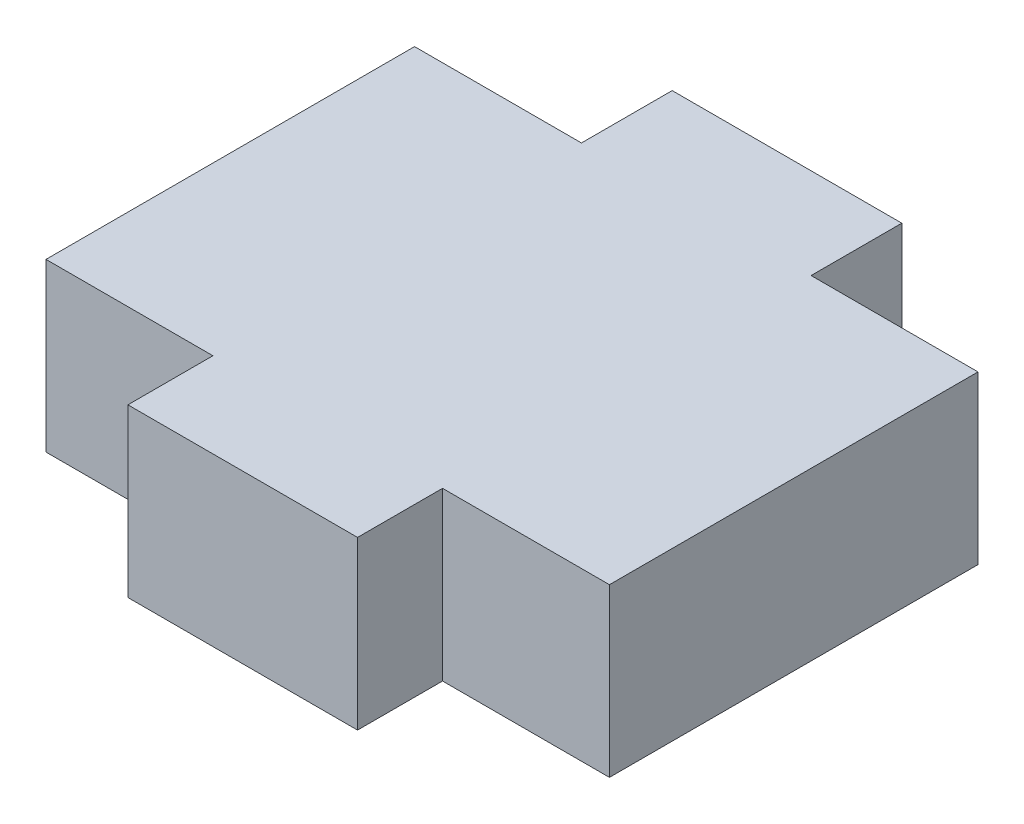
ISO-10303-21;
HEADER;
FILE_DESCRIPTION(('STEP AP214'),'2;1');
FILE_NAME('part.step','',(''),(''),'','','');
FILE_SCHEMA(('AUTOMOTIVE_DESIGN { 1 0 10303 214 1 1 1 1 }'));
ENDSEC;
DATA;
#1=APPLICATION_CONTEXT('core data for automotive mechanical design processes');
#2=APPLICATION_PROTOCOL_DEFINITION('international standard','automotive_design',2000,#1);
#3=PRODUCT_CONTEXT('',#1,'mechanical');
#4=PRODUCT('Part','Part','',(#3));
#5=PRODUCT_RELATED_PRODUCT_CATEGORY('part','',(#4));
#6=PRODUCT_DEFINITION_FORMATION('','',#4);
#7=PRODUCT_DEFINITION_CONTEXT('part definition',#1,'design');
#8=PRODUCT_DEFINITION('design','',#6,#7);
#9=PRODUCT_DEFINITION_SHAPE('','',#8);
#10=(LENGTH_UNIT() NAMED_UNIT(*) SI_UNIT(.MILLI.,.METRE.));
#11=(NAMED_UNIT(*) PLANE_ANGLE_UNIT() SI_UNIT($,.RADIAN.));
#12=(NAMED_UNIT(*) SI_UNIT($,.STERADIAN.) SOLID_ANGLE_UNIT());
#13=UNCERTAINTY_MEASURE_WITH_UNIT(LENGTH_MEASURE(1.E-05),#10,'distance_accuracy_value','');
#14=(GEOMETRIC_REPRESENTATION_CONTEXT(3) GLOBAL_UNCERTAINTY_ASSIGNED_CONTEXT((#13)) GLOBAL_UNIT_ASSIGNED_CONTEXT((#10,
#11,#12)) REPRESENTATION_CONTEXT('',''));
#15=CARTESIAN_POINT('',(0.,0.,0.));
#16=DIRECTION('',(0.,0.,1.));
#17=DIRECTION('',(1.,0.,0.));
#18=AXIS2_PLACEMENT_3D('',#15,#16,#17);
#19=CARTESIAN_POINT('',(0.,5.842,0.));
#20=DIRECTION('',(-1.,0.,0.));
#21=DIRECTION('',(0.,0.,1.));
#22=AXIS2_PLACEMENT_3D('',#19,#20,#21);
#23=PLANE('',#22);
#24=DIRECTION('',(0.,0.,-1.));
#25=VECTOR('',#24,1.);
#26=CARTESIAN_POINT('',(0.,0.,0.));
#27=LINE('',#26,#25);
#28=CARTESIAN_POINT('',(0.,0.,0.));
#29=VERTEX_POINT('',#28);
#30=CARTESIAN_POINT('',(0.,0.,-2.975));
#31=VERTEX_POINT('',#30);
#32=EDGE_CURVE('E158',#29,#31,#27,.T.);
#33=ORIENTED_EDGE('',*,*,#32,.T.);
#34=DIRECTION('',(0.,-1.,0.));
#35=VECTOR('',#34,1.);
#36=CARTESIAN_POINT('',(0.,5.842,-2.975));
#37=LINE('',#36,#35);
#38=CARTESIAN_POINT('',(0.,5.842,-2.975));
#39=VERTEX_POINT('',#38);
#40=EDGE_CURVE('E11',#39,#31,#37,.T.);
#41=ORIENTED_EDGE('',*,*,#40,.F.);
#42=DIRECTION('',(0.,0.,-1.));
#43=VECTOR('',#42,1.);
#44=CARTESIAN_POINT('',(0.,5.842,0.));
#45=LINE('',#44,#43);
#46=CARTESIAN_POINT('',(0.,5.842,0.));
#47=VERTEX_POINT('',#46);
#48=EDGE_CURVE('E180',#47,#39,#45,.T.);
#49=ORIENTED_EDGE('',*,*,#48,.F.);
#50=DIRECTION('',(0.,-1.,0.));
#51=VECTOR('',#50,1.);
#52=CARTESIAN_POINT('',(0.,5.842,0.));
#53=LINE('',#52,#51);
#54=EDGE_CURVE('E154',#47,#29,#53,.T.);
#55=ORIENTED_EDGE('',*,*,#54,.T.);
#56=EDGE_LOOP('',(#33,#41,#49,#55));
#57=FACE_BOUND('',#56,.T.);
#58=ADVANCED_FACE('F38',(#57),#23,.F.);
#59=CARTESIAN_POINT('',(0.,5.842,-2.975));
#60=DIRECTION('',(0.,0.,-1.));
#61=DIRECTION('',(-1.,0.,0.));
#62=AXIS2_PLACEMENT_3D('',#59,#60,#61);
#63=PLANE('',#62);
#64=DIRECTION('',(1.,0.,0.));
#65=VECTOR('',#64,1.);
#66=CARTESIAN_POINT('',(0.,0.,-2.975));
#67=LINE('',#66,#65);
#68=CARTESIAN_POINT('',(5.842,0.,-2.975));
#69=VERTEX_POINT('',#68);
#70=EDGE_CURVE('E161',#31,#69,#67,.T.);
#71=ORIENTED_EDGE('',*,*,#70,.T.);
#72=DIRECTION('',(0.,-1.,0.));
#73=VECTOR('',#72,1.);
#74=CARTESIAN_POINT('',(5.842,5.842,-2.975));
#75=LINE('',#74,#73);
#76=CARTESIAN_POINT('',(5.842,5.842,-2.975));
#77=VERTEX_POINT('',#76);
#78=EDGE_CURVE('E46',#77,#69,#75,.T.);
#79=ORIENTED_EDGE('',*,*,#78,.F.);
#80=DIRECTION('',(1.,0.,0.));
#81=VECTOR('',#80,1.);
#82=CARTESIAN_POINT('',(0.,5.842,-2.975));
#83=LINE('',#82,#81);
#84=EDGE_CURVE('E109',#39,#77,#83,.T.);
#85=ORIENTED_EDGE('',*,*,#84,.F.);
#86=ORIENTED_EDGE('',*,*,#40,.T.);
#87=EDGE_LOOP('',(#71,#79,#85,#86));
#88=FACE_BOUND('',#87,.T.);
#89=ADVANCED_FACE('F258',(#88),#63,.F.);
#90=CARTESIAN_POINT('',(5.842,5.842,-2.975));
#91=DIRECTION('',(-1.,0.,0.));
#92=DIRECTION('',(0.,0.,1.));
#93=AXIS2_PLACEMENT_3D('',#90,#91,#92);
#94=PLANE('',#93);
#95=DIRECTION('',(0.,0.,-1.));
#96=VECTOR('',#95,1.);
#97=CARTESIAN_POINT('',(5.842,0.,-2.975));
#98=LINE('',#97,#96);
#99=CARTESIAN_POINT('',(5.842,0.,-15.875));
#100=VERTEX_POINT('',#99);
#101=EDGE_CURVE('E163',#69,#100,#98,.T.);
#102=ORIENTED_EDGE('',*,*,#101,.T.);
#103=DIRECTION('',(0.,-1.,0.));
#104=VECTOR('',#103,1.);
#105=CARTESIAN_POINT('',(5.842,5.842,-15.875));
#106=LINE('',#105,#104);
#107=CARTESIAN_POINT('',(5.842,5.842,-15.875));
#108=VERTEX_POINT('',#107);
#109=EDGE_CURVE('E199',#108,#100,#106,.T.);
#110=ORIENTED_EDGE('',*,*,#109,.F.);
#111=DIRECTION('',(0.,0.,-1.));
#112=VECTOR('',#111,1.);
#113=CARTESIAN_POINT('',(5.842,5.842,-2.975));
#114=LINE('',#113,#112);
#115=EDGE_CURVE('E207',#77,#108,#114,.T.);
#116=ORIENTED_EDGE('',*,*,#115,.F.);
#117=ORIENTED_EDGE('',*,*,#78,.T.);
#118=EDGE_LOOP('',(#102,#110,#116,#117));
#119=FACE_BOUND('',#118,.T.);
#120=ADVANCED_FACE('F205',(#119),#94,.F.);
#121=CARTESIAN_POINT('',(0.,5.842,-15.875));
#122=DIRECTION('',(0.,0.,1.));
#123=DIRECTION('',(1.,0.,0.));
#124=AXIS2_PLACEMENT_3D('',#121,#122,#123);
#125=PLANE('',#124);
#126=DIRECTION('',(-1.,0.,0.));
#127=VECTOR('',#126,1.);
#128=CARTESIAN_POINT('',(0.,0.,-15.875));
#129=LINE('',#128,#127);
#130=CARTESIAN_POINT('',(0.,0.,-15.875));
#131=VERTEX_POINT('',#130);
#132=EDGE_CURVE('E165',#100,#131,#129,.T.);
#133=ORIENTED_EDGE('',*,*,#132,.T.);
#134=DIRECTION('',(0.,-1.,0.));
#135=VECTOR('',#134,1.);
#136=CARTESIAN_POINT('',(0.,5.842,-15.875));
#137=LINE('',#136,#135);
#138=CARTESIAN_POINT('',(0.,5.842,-15.875));
#139=VERTEX_POINT('',#138);
#140=EDGE_CURVE('E196',#139,#131,#137,.T.);
#141=ORIENTED_EDGE('',*,*,#140,.F.);
#142=DIRECTION('',(-1.,0.,0.));
#143=VECTOR('',#142,1.);
#144=CARTESIAN_POINT('',(0.,5.842,-15.875));
#145=LINE('',#144,#143);
#146=EDGE_CURVE('E225',#108,#139,#145,.T.);
#147=ORIENTED_EDGE('',*,*,#146,.F.);
#148=ORIENTED_EDGE('',*,*,#109,.T.);
#149=EDGE_LOOP('',(#133,#141,#147,#148));
#150=FACE_BOUND('',#149,.T.);
#151=ADVANCED_FACE('F216',(#150),#125,.F.);
#152=CARTESIAN_POINT('',(0.,5.842,-15.875));
#153=DIRECTION('',(-1.,0.,0.));
#154=DIRECTION('',(0.,0.,1.));
#155=AXIS2_PLACEMENT_3D('',#152,#153,#154);
#156=PLANE('',#155);
#157=DIRECTION('',(0.,0.,-1.));
#158=VECTOR('',#157,1.);
#159=CARTESIAN_POINT('',(0.,0.,-15.875));
#160=LINE('',#159,#158);
#161=CARTESIAN_POINT('',(0.,0.,-19.05));
#162=VERTEX_POINT('',#161);
#163=EDGE_CURVE('E167',#131,#162,#160,.T.);
#164=ORIENTED_EDGE('',*,*,#163,.T.);
#165=DIRECTION('',(0.,-1.,0.));
#166=VECTOR('',#165,1.);
#167=CARTESIAN_POINT('',(0.,5.842,-19.05));
#168=LINE('',#167,#166);
#169=CARTESIAN_POINT('',(0.,5.842,-19.05));
#170=VERTEX_POINT('',#169);
#171=EDGE_CURVE('E193',#170,#162,#168,.T.);
#172=ORIENTED_EDGE('',*,*,#171,.F.);
#173=DIRECTION('',(0.,0.,-1.));
#174=VECTOR('',#173,1.);
#175=CARTESIAN_POINT('',(0.,5.842,-15.875));
#176=LINE('',#175,#174);
#177=EDGE_CURVE('E222',#139,#170,#176,.T.);
#178=ORIENTED_EDGE('',*,*,#177,.F.);
#179=ORIENTED_EDGE('',*,*,#140,.T.);
#180=EDGE_LOOP('',(#164,#172,#178,#179));
#181=FACE_BOUND('',#180,.T.);
#182=ADVANCED_FACE('F220',(#181),#156,.F.);
#183=CARTESIAN_POINT('',(0.,5.842,-19.05));
#184=DIRECTION('',(0.,0.,1.));
#185=DIRECTION('',(1.,0.,0.));
#186=AXIS2_PLACEMENT_3D('',#183,#184,#185);
#187=PLANE('',#186);
#188=DIRECTION('',(-1.,0.,0.));
#189=VECTOR('',#188,1.);
#190=CARTESIAN_POINT('',(0.,0.,-19.05));
#191=LINE('',#190,#189);
#192=CARTESIAN_POINT('',(-8.0375,0.,-19.05));
#193=VERTEX_POINT('',#192);
#194=EDGE_CURVE('E169',#162,#193,#191,.T.);
#195=ORIENTED_EDGE('',*,*,#194,.T.);
#196=DIRECTION('',(0.,-1.,0.));
#197=VECTOR('',#196,1.);
#198=CARTESIAN_POINT('',(-8.0375,5.842,-19.05));
#199=LINE('',#198,#197);
#200=CARTESIAN_POINT('',(-8.0375,5.842,-19.05));
#201=VERTEX_POINT('',#200);
#202=EDGE_CURVE('E190',#201,#193,#199,.T.);
#203=ORIENTED_EDGE('',*,*,#202,.F.);
#204=DIRECTION('',(-1.,0.,0.));
#205=VECTOR('',#204,1.);
#206=CARTESIAN_POINT('',(0.,5.842,-19.05));
#207=LINE('',#206,#205);
#208=EDGE_CURVE('E224',#170,#201,#207,.T.);
#209=ORIENTED_EDGE('',*,*,#208,.F.);
#210=ORIENTED_EDGE('',*,*,#171,.T.);
#211=EDGE_LOOP('',(#195,#203,#209,#210));
#212=FACE_BOUND('',#211,.T.);
#213=ADVANCED_FACE('F271',(#212),#187,.F.);
#214=CARTESIAN_POINT('',(-8.03750000000001,5.842,-15.875));
#215=DIRECTION('',(1.,0.,0.));
#216=DIRECTION('',(0.,0.,-1.));
#217=AXIS2_PLACEMENT_3D('',#214,#215,#216);
#218=PLANE('',#217);
#219=DIRECTION('',(0.,0.,1.));
#220=VECTOR('',#219,1.);
#221=CARTESIAN_POINT('',(-8.03750000000001,0.,-15.875));
#222=LINE('',#221,#220);
#223=CARTESIAN_POINT('',(-8.03750000000001,0.,-15.875));
#224=VERTEX_POINT('',#223);
#225=EDGE_CURVE('E171',#193,#224,#222,.T.);
#226=ORIENTED_EDGE('',*,*,#225,.T.);
#227=DIRECTION('',(0.,-1.,0.));
#228=VECTOR('',#227,1.);
#229=CARTESIAN_POINT('',(-8.03750000000001,5.842,-15.875));
#230=LINE('',#229,#228);
#231=CARTESIAN_POINT('',(-8.03750000000001,5.842,-15.875));
#232=VERTEX_POINT('',#231);
#233=EDGE_CURVE('E187',#232,#224,#230,.T.);
#234=ORIENTED_EDGE('',*,*,#233,.F.);
#235=DIRECTION('',(0.,0.,1.));
#236=VECTOR('',#235,1.);
#237=CARTESIAN_POINT('',(-8.03750000000001,5.842,-15.875));
#238=LINE('',#237,#236);
#239=EDGE_CURVE('E227',#201,#232,#238,.T.);
#240=ORIENTED_EDGE('',*,*,#239,.F.);
#241=ORIENTED_EDGE('',*,*,#202,.T.);
#242=EDGE_LOOP('',(#226,#234,#240,#241));
#243=FACE_BOUND('',#242,.T.);
#244=ADVANCED_FACE('F274',(#243),#218,.F.);
#245=CARTESIAN_POINT('',(-8.03750000000001,5.842,-15.875));
#246=DIRECTION('',(0.,0.,1.));
#247=DIRECTION('',(1.,0.,0.));
#248=AXIS2_PLACEMENT_3D('',#245,#246,#247);
#249=PLANE('',#248);
#250=DIRECTION('',(-1.,0.,0.));
#251=VECTOR('',#250,1.);
#252=CARTESIAN_POINT('',(-8.03750000000001,0.,-15.875));
#253=LINE('',#252,#251);
#254=CARTESIAN_POINT('',(-13.8795,0.,-15.875));
#255=VERTEX_POINT('',#254);
#256=EDGE_CURVE('E173',#224,#255,#253,.T.);
#257=ORIENTED_EDGE('',*,*,#256,.T.);
#258=DIRECTION('',(0.,-1.,0.));
#259=VECTOR('',#258,1.);
#260=CARTESIAN_POINT('',(-13.8795,5.842,-15.875));
#261=LINE('',#260,#259);
#262=CARTESIAN_POINT('',(-13.8795,5.842,-15.875));
#263=VERTEX_POINT('',#262);
#264=EDGE_CURVE('E184',#263,#255,#261,.T.);
#265=ORIENTED_EDGE('',*,*,#264,.F.);
#266=DIRECTION('',(-1.,0.,0.));
#267=VECTOR('',#266,1.);
#268=CARTESIAN_POINT('',(-8.03750000000001,5.842,-15.875));
#269=LINE('',#268,#267);
#270=EDGE_CURVE('E233',#232,#263,#269,.T.);
#271=ORIENTED_EDGE('',*,*,#270,.F.);
#272=ORIENTED_EDGE('',*,*,#233,.T.);
#273=EDGE_LOOP('',(#257,#265,#271,#272));
#274=FACE_BOUND('',#273,.T.);
#275=ADVANCED_FACE('F239',(#274),#249,.F.);
#276=CARTESIAN_POINT('',(-13.8795,5.842,-2.975));
#277=DIRECTION('',(1.,0.,0.));
#278=DIRECTION('',(0.,0.,-1.));
#279=AXIS2_PLACEMENT_3D('',#276,#277,#278);
#280=PLANE('',#279);
#281=DIRECTION('',(0.,0.,1.));
#282=VECTOR('',#281,1.);
#283=CARTESIAN_POINT('',(-13.8795,0.,-2.975));
#284=LINE('',#283,#282);
#285=CARTESIAN_POINT('',(-13.8795,0.,-2.975));
#286=VERTEX_POINT('',#285);
#287=EDGE_CURVE('E175',#255,#286,#284,.T.);
#288=ORIENTED_EDGE('',*,*,#287,.T.);
#289=DIRECTION('',(0.,-1.,0.));
#290=VECTOR('',#289,1.);
#291=CARTESIAN_POINT('',(-13.8795,5.842,-2.975));
#292=LINE('',#291,#290);
#293=CARTESIAN_POINT('',(-13.8795,5.842,-2.975));
#294=VERTEX_POINT('',#293);
#295=EDGE_CURVE('E149',#294,#286,#292,.T.);
#296=ORIENTED_EDGE('',*,*,#295,.F.);
#297=DIRECTION('',(0.,0.,1.));
#298=VECTOR('',#297,1.);
#299=CARTESIAN_POINT('',(-13.8795,5.842,-2.975));
#300=LINE('',#299,#298);
#301=EDGE_CURVE('E140',#263,#294,#300,.T.);
#302=ORIENTED_EDGE('',*,*,#301,.F.);
#303=ORIENTED_EDGE('',*,*,#264,.T.);
#304=EDGE_LOOP('',(#288,#296,#302,#303));
#305=FACE_BOUND('',#304,.T.);
#306=ADVANCED_FACE('F243',(#305),#280,.F.);
#307=CARTESIAN_POINT('',(-8.0375,5.842,-2.975));
#308=DIRECTION('',(0.,0.,-1.));
#309=DIRECTION('',(-1.,0.,0.));
#310=AXIS2_PLACEMENT_3D('',#307,#308,#309);
#311=PLANE('',#310);
#312=DIRECTION('',(1.,0.,0.));
#313=VECTOR('',#312,1.);
#314=CARTESIAN_POINT('',(-8.0375,0.,-2.975));
#315=LINE('',#314,#313);
#316=CARTESIAN_POINT('',(-8.0375,0.,-2.975));
#317=VERTEX_POINT('',#316);
#318=EDGE_CURVE('E148',#286,#317,#315,.T.);
#319=ORIENTED_EDGE('',*,*,#318,.T.);
#320=DIRECTION('',(0.,-1.,0.));
#321=VECTOR('',#320,1.);
#322=CARTESIAN_POINT('',(-8.0375,5.842,-2.975));
#323=LINE('',#322,#321);
#324=CARTESIAN_POINT('',(-8.0375,5.842,-2.975));
#325=VERTEX_POINT('',#324);
#326=EDGE_CURVE('E145',#325,#317,#323,.T.);
#327=ORIENTED_EDGE('',*,*,#326,.F.);
#328=DIRECTION('',(1.,0.,0.));
#329=VECTOR('',#328,1.);
#330=CARTESIAN_POINT('',(-8.0375,5.842,-2.975));
#331=LINE('',#330,#329);
#332=EDGE_CURVE('E134',#294,#325,#331,.T.);
#333=ORIENTED_EDGE('',*,*,#332,.F.);
#334=ORIENTED_EDGE('',*,*,#295,.T.);
#335=EDGE_LOOP('',(#319,#327,#333,#334));
#336=FACE_BOUND('',#335,.T.);
#337=ADVANCED_FACE('F146',(#336),#311,.F.);
#338=CARTESIAN_POINT('',(-8.0375,5.842,0.));
#339=DIRECTION('',(1.,0.,0.));
#340=DIRECTION('',(0.,0.,-1.));
#341=AXIS2_PLACEMENT_3D('',#338,#339,#340);
#342=PLANE('',#341);
#343=DIRECTION('',(0.,0.,1.));
#344=VECTOR('',#343,1.);
#345=CARTESIAN_POINT('',(-8.0375,0.,0.));
#346=LINE('',#345,#344);
#347=CARTESIAN_POINT('',(-8.0375,0.,0.));
#348=VERTEX_POINT('',#347);
#349=EDGE_CURVE('E95',#317,#348,#346,.T.);
#350=ORIENTED_EDGE('',*,*,#349,.T.);
#351=DIRECTION('',(0.,-1.,0.));
#352=VECTOR('',#351,1.);
#353=CARTESIAN_POINT('',(-8.0375,5.842,0.));
#354=LINE('',#353,#352);
#355=CARTESIAN_POINT('',(-8.0375,5.842,0.));
#356=VERTEX_POINT('',#355);
#357=EDGE_CURVE('E150',#356,#348,#354,.T.);
#358=ORIENTED_EDGE('',*,*,#357,.F.);
#359=DIRECTION('',(0.,0.,1.));
#360=VECTOR('',#359,1.);
#361=CARTESIAN_POINT('',(-8.0375,5.842,0.));
#362=LINE('',#361,#360);
#363=EDGE_CURVE('E138',#325,#356,#362,.T.);
#364=ORIENTED_EDGE('',*,*,#363,.F.);
#365=ORIENTED_EDGE('',*,*,#326,.T.);
#366=EDGE_LOOP('',(#350,#358,#364,#365));
#367=FACE_BOUND('',#366,.T.);
#368=ADVANCED_FACE('F152',(#367),#342,.F.);
#369=CARTESIAN_POINT('',(0.,5.842,0.));
#370=DIRECTION('',(0.,0.,-1.));
#371=DIRECTION('',(-1.,0.,0.));
#372=AXIS2_PLACEMENT_3D('',#369,#370,#371);
#373=PLANE('',#372);
#374=DIRECTION('',(1.,0.,0.));
#375=VECTOR('',#374,1.);
#376=CARTESIAN_POINT('',(0.,0.,0.));
#377=LINE('',#376,#375);
#378=EDGE_CURVE('E101',#348,#29,#377,.T.);
#379=ORIENTED_EDGE('',*,*,#378,.T.);
#380=ORIENTED_EDGE('',*,*,#54,.F.);
#381=DIRECTION('',(1.,0.,0.));
#382=VECTOR('',#381,1.);
#383=CARTESIAN_POINT('',(0.,5.842,0.));
#384=LINE('',#383,#382);
#385=EDGE_CURVE('E54',#356,#47,#384,.T.);
#386=ORIENTED_EDGE('',*,*,#385,.F.);
#387=ORIENTED_EDGE('',*,*,#357,.T.);
#388=EDGE_LOOP('',(#379,#380,#386,#387));
#389=FACE_BOUND('',#388,.T.);
#390=ADVANCED_FACE('F247',(#389),#373,.F.);
#391=CARTESIAN_POINT('',(0.,5.842,0.));
#392=DIRECTION('',(0.,-1.,0.));
#393=DIRECTION('',(0.,0.,-1.));
#394=AXIS2_PLACEMENT_3D('',#391,#392,#393);
#395=PLANE('',#394);
#396=ORIENTED_EDGE('',*,*,#48,.T.);
#397=ORIENTED_EDGE('',*,*,#84,.T.);
#398=ORIENTED_EDGE('',*,*,#115,.T.);
#399=ORIENTED_EDGE('',*,*,#146,.T.);
#400=ORIENTED_EDGE('',*,*,#177,.T.);
#401=ORIENTED_EDGE('',*,*,#208,.T.);
#402=ORIENTED_EDGE('',*,*,#239,.T.);
#403=ORIENTED_EDGE('',*,*,#270,.T.);
#404=ORIENTED_EDGE('',*,*,#301,.T.);
#405=ORIENTED_EDGE('',*,*,#332,.T.);
#406=ORIENTED_EDGE('',*,*,#363,.T.);
#407=ORIENTED_EDGE('',*,*,#385,.T.);
#408=EDGE_LOOP('',(#396,#397,#398,#399,#400,#401,#402,#403,#404,#405,#406,#407));
#409=FACE_BOUND('',#408,.T.);
#410=ADVANCED_FACE('F136',(#409),#395,.F.);
#411=CARTESIAN_POINT('',(0.,0.,0.));
#412=DIRECTION('',(0.,-1.,0.));
#413=DIRECTION('',(0.,0.,-1.));
#414=AXIS2_PLACEMENT_3D('',#411,#412,#413);
#415=PLANE('',#414);
#416=ORIENTED_EDGE('',*,*,#32,.F.);
#417=ORIENTED_EDGE('',*,*,#378,.F.);
#418=ORIENTED_EDGE('',*,*,#349,.F.);
#419=ORIENTED_EDGE('',*,*,#318,.F.);
#420=ORIENTED_EDGE('',*,*,#287,.F.);
#421=ORIENTED_EDGE('',*,*,#256,.F.);
#422=ORIENTED_EDGE('',*,*,#225,.F.);
#423=ORIENTED_EDGE('',*,*,#194,.F.);
#424=ORIENTED_EDGE('',*,*,#163,.F.);
#425=ORIENTED_EDGE('',*,*,#132,.F.);
#426=ORIENTED_EDGE('',*,*,#101,.F.);
#427=ORIENTED_EDGE('',*,*,#70,.F.);
#428=EDGE_LOOP('',(#416,#417,#418,#419,#420,#421,#422,#423,#424,#425,#426,#427));
#429=FACE_BOUND('',#428,.T.);
#430=ADVANCED_FACE('F211',(#429),#415,.T.);
#431=CLOSED_SHELL('',(#58,#89,#120,#151,#182,#213,#244,#275,#306,#337,#368,#390,#410,#430));
#432=MANIFOLD_SOLID_BREP('B2',#431);
#433=ADVANCED_BREP_SHAPE_REPRESENTATION('',(#18,#432),#14);
#434=SHAPE_DEFINITION_REPRESENTATION(#9,#433);
ENDSEC;
END-ISO-10303-21;
